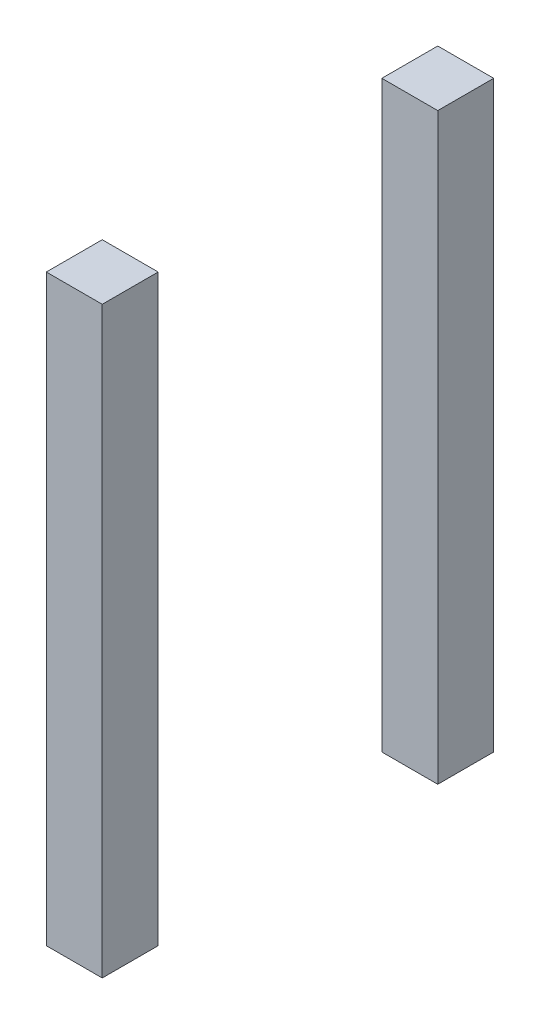
ISO-10303-21;
HEADER;
FILE_DESCRIPTION(('STEP AP214'),'2;1');
FILE_NAME('part.step','',(''),(''),'','','');
FILE_SCHEMA(('AUTOMOTIVE_DESIGN { 1 0 10303 214 1 1 1 1 }'));
ENDSEC;
DATA;
#1=APPLICATION_CONTEXT('core data for automotive mechanical design processes');
#2=APPLICATION_PROTOCOL_DEFINITION('international standard','automotive_design',2000,#1);
#3=PRODUCT_CONTEXT('',#1,'mechanical');
#4=PRODUCT('Part','Part','',(#3));
#5=PRODUCT_RELATED_PRODUCT_CATEGORY('part','',(#4));
#6=PRODUCT_DEFINITION_FORMATION('','',#4);
#7=PRODUCT_DEFINITION_CONTEXT('part definition',#1,'design');
#8=PRODUCT_DEFINITION('design','',#6,#7);
#9=PRODUCT_DEFINITION_SHAPE('','',#8);
#10=(LENGTH_UNIT() NAMED_UNIT(*) SI_UNIT(.MILLI.,.METRE.));
#11=(NAMED_UNIT(*) PLANE_ANGLE_UNIT() SI_UNIT($,.RADIAN.));
#12=(NAMED_UNIT(*) SI_UNIT($,.STERADIAN.) SOLID_ANGLE_UNIT());
#13=UNCERTAINTY_MEASURE_WITH_UNIT(LENGTH_MEASURE(1.E-05),#10,'distance_accuracy_value','');
#14=(GEOMETRIC_REPRESENTATION_CONTEXT(3) GLOBAL_UNCERTAINTY_ASSIGNED_CONTEXT((#13)) GLOBAL_UNIT_ASSIGNED_CONTEXT((#10,
#11,#12)) REPRESENTATION_CONTEXT('',''));
#15=CARTESIAN_POINT('',(0.,0.,0.));
#16=DIRECTION('',(0.,0.,1.));
#17=DIRECTION('',(1.,0.,0.));
#18=AXIS2_PLACEMENT_3D('',#15,#16,#17);
#19=CARTESIAN_POINT('',(0.,-45.0088951198897,0.));
#20=DIRECTION('',(0.,1.,0.));
#21=DIRECTION('',(0.,0.,1.));
#22=AXIS2_PLACEMENT_3D('',#19,#20,#21);
#23=PLANE('',#22);
#24=DIRECTION('',(0.,0.,1.));
#25=VECTOR('',#24,1.);
#26=CARTESIAN_POINT('',(-76.5788995902752,-45.0088951198897,50.3534205439696));
#27=LINE('',#26,#25);
#28=CARTESIAN_POINT('',(-76.5788995902752,-45.0088951198897,41.0824205439696));
#29=VERTEX_POINT('',#28);
#30=CARTESIAN_POINT('',(-76.5788995902752,-45.0088951198897,50.3534205439696));
#31=VERTEX_POINT('',#30);
#32=EDGE_CURVE('E93',#29,#31,#27,.T.);
#33=ORIENTED_EDGE('',*,*,#32,.F.);
#34=DIRECTION('',(-1.,0.,0.));
#35=VECTOR('',#34,1.);
#36=CARTESIAN_POINT('',(-67.3078995902752,-45.0088951198897,41.0824205439696));
#37=LINE('',#36,#35);
#38=CARTESIAN_POINT('',(-67.3078995902752,-45.0088951198897,41.0824205439696));
#39=VERTEX_POINT('',#38);
#40=EDGE_CURVE('E104',#39,#29,#37,.T.);
#41=ORIENTED_EDGE('',*,*,#40,.F.);
#42=DIRECTION('',(0.,0.,-1.));
#43=VECTOR('',#42,1.);
#44=CARTESIAN_POINT('',(-67.3078995902752,-45.0088951198897,50.3534205439696));
#45=LINE('',#44,#43);
#46=CARTESIAN_POINT('',(-67.3078995902752,-45.0088951198897,50.3534205439696));
#47=VERTEX_POINT('',#46);
#48=EDGE_CURVE('E95',#47,#39,#45,.T.);
#49=ORIENTED_EDGE('',*,*,#48,.F.);
#50=DIRECTION('',(1.,0.,0.));
#51=VECTOR('',#50,1.);
#52=CARTESIAN_POINT('',(-67.3078995902752,-45.0088951198897,50.3534205439696));
#53=LINE('',#52,#51);
#54=EDGE_CURVE('E85',#31,#47,#53,.T.);
#55=ORIENTED_EDGE('',*,*,#54,.F.);
#56=EDGE_LOOP('',(#33,#41,#49,#55));
#57=FACE_BOUND('',#56,.T.);
#58=ADVANCED_FACE('F43',(#57),#23,.F.);
#59=CARTESIAN_POINT('',(-67.3078995902752,64.833945483538,41.0824205439696));
#60=DIRECTION('',(0.,0.,1.));
#61=DIRECTION('',(1.,0.,0.));
#62=AXIS2_PLACEMENT_3D('',#59,#60,#61);
#63=PLANE('',#62);
#64=DIRECTION('',(0.,-1.,0.));
#65=VECTOR('',#64,1.);
#66=CARTESIAN_POINT('',(-76.5788995902752,64.833945483538,41.0824205439696));
#67=LINE('',#66,#65);
#68=CARTESIAN_POINT('',(-76.5788995902752,51.722771546777,41.0824205439696));
#69=VERTEX_POINT('',#68);
#70=EDGE_CURVE('E98',#69,#29,#67,.T.);
#71=ORIENTED_EDGE('',*,*,#70,.F.);
#72=DIRECTION('',(1.,0.,0.));
#73=VECTOR('',#72,1.);
#74=CARTESIAN_POINT('',(-67.3078995902752,51.722771546777,41.0824205439696));
#75=LINE('',#74,#73);
#76=CARTESIAN_POINT('',(-67.3078995902752,51.722771546777,41.0824205439696));
#77=VERTEX_POINT('',#76);
#78=EDGE_CURVE('E47',#69,#77,#75,.T.);
#79=ORIENTED_EDGE('',*,*,#78,.T.);
#80=DIRECTION('',(0.,-1.,0.));
#81=VECTOR('',#80,1.);
#82=CARTESIAN_POINT('',(-67.3078995902752,64.833945483538,41.0824205439696));
#83=LINE('',#82,#81);
#84=EDGE_CURVE('E107',#77,#39,#83,.T.);
#85=ORIENTED_EDGE('',*,*,#84,.T.);
#86=ORIENTED_EDGE('',*,*,#40,.T.);
#87=EDGE_LOOP('',(#71,#79,#85,#86));
#88=FACE_BOUND('',#87,.T.);
#89=ADVANCED_FACE('F116',(#88),#63,.F.);
#90=CARTESIAN_POINT('',(-67.3078995902752,64.833945483538,50.3534205439696));
#91=DIRECTION('',(-1.,0.,0.));
#92=DIRECTION('',(0.,0.,1.));
#93=AXIS2_PLACEMENT_3D('',#90,#91,#92);
#94=PLANE('',#93);
#95=ORIENTED_EDGE('',*,*,#84,.F.);
#96=DIRECTION('',(0.,0.,1.));
#97=VECTOR('',#96,1.);
#98=CARTESIAN_POINT('',(-67.3078995902752,51.722771546777,50.3534205439696));
#99=LINE('',#98,#97);
#100=CARTESIAN_POINT('',(-67.3078995902752,51.722771546777,50.3534205439696));
#101=VERTEX_POINT('',#100);
#102=EDGE_CURVE('E113',#77,#101,#99,.T.);
#103=ORIENTED_EDGE('',*,*,#102,.T.);
#104=DIRECTION('',(0.,-1.,0.));
#105=VECTOR('',#104,1.);
#106=CARTESIAN_POINT('',(-67.3078995902752,64.833945483538,50.3534205439696));
#107=LINE('',#106,#105);
#108=EDGE_CURVE('E89',#101,#47,#107,.T.);
#109=ORIENTED_EDGE('',*,*,#108,.T.);
#110=ORIENTED_EDGE('',*,*,#48,.T.);
#111=EDGE_LOOP('',(#95,#103,#109,#110));
#112=FACE_BOUND('',#111,.T.);
#113=ADVANCED_FACE('F112',(#112),#94,.F.);
#114=CARTESIAN_POINT('',(-67.3078995902752,64.833945483538,50.3534205439696));
#115=DIRECTION('',(0.,0.,-1.));
#116=DIRECTION('',(-1.,0.,0.));
#117=AXIS2_PLACEMENT_3D('',#114,#115,#116);
#118=PLANE('',#117);
#119=ORIENTED_EDGE('',*,*,#108,.F.);
#120=DIRECTION('',(-1.,0.,0.));
#121=VECTOR('',#120,1.);
#122=CARTESIAN_POINT('',(-67.3078995902752,51.722771546777,50.3534205439696));
#123=LINE('',#122,#121);
#124=CARTESIAN_POINT('',(-76.5788995902752,51.722771546777,50.3534205439696));
#125=VERTEX_POINT('',#124);
#126=EDGE_CURVE('E52',#101,#125,#123,.T.);
#127=ORIENTED_EDGE('',*,*,#126,.T.);
#128=DIRECTION('',(0.,-1.,0.));
#129=VECTOR('',#128,1.);
#130=CARTESIAN_POINT('',(-76.5788995902752,64.833945483538,50.3534205439696));
#131=LINE('',#130,#129);
#132=EDGE_CURVE('E82',#125,#31,#131,.T.);
#133=ORIENTED_EDGE('',*,*,#132,.T.);
#134=ORIENTED_EDGE('',*,*,#54,.T.);
#135=EDGE_LOOP('',(#119,#127,#133,#134));
#136=FACE_BOUND('',#135,.T.);
#137=ADVANCED_FACE('F84',(#136),#118,.F.);
#138=CARTESIAN_POINT('',(-76.5788995902752,64.833945483538,50.3534205439696));
#139=DIRECTION('',(1.,0.,0.));
#140=DIRECTION('',(0.,0.,-1.));
#141=AXIS2_PLACEMENT_3D('',#138,#139,#140);
#142=PLANE('',#141);
#143=ORIENTED_EDGE('',*,*,#132,.F.);
#144=DIRECTION('',(0.,0.,-1.));
#145=VECTOR('',#144,1.);
#146=CARTESIAN_POINT('',(-76.5788995902752,51.722771546777,50.3534205439696));
#147=LINE('',#146,#145);
#148=EDGE_CURVE('E12',#125,#69,#147,.T.);
#149=ORIENTED_EDGE('',*,*,#148,.T.);
#150=ORIENTED_EDGE('',*,*,#70,.T.);
#151=ORIENTED_EDGE('',*,*,#32,.T.);
#152=EDGE_LOOP('',(#143,#149,#150,#151));
#153=FACE_BOUND('',#152,.T.);
#154=ADVANCED_FACE('F45',(#153),#142,.F.);
#155=CARTESIAN_POINT('',(-80.6591041345707,51.722771546777,62.3549205439696));
#156=DIRECTION('',(0.,-1.,0.));
#157=DIRECTION('',(0.,0.,-1.));
#158=AXIS2_PLACEMENT_3D('',#155,#156,#157);
#159=PLANE('',#158);
#160=ORIENTED_EDGE('',*,*,#126,.F.);
#161=ORIENTED_EDGE('',*,*,#102,.F.);
#162=ORIENTED_EDGE('',*,*,#78,.F.);
#163=ORIENTED_EDGE('',*,*,#148,.F.);
#164=EDGE_LOOP('',(#160,#161,#162,#163));
#165=FACE_BOUND('',#164,.T.);
#166=ADVANCED_FACE('F130',(#165),#159,.F.);
#167=CLOSED_SHELL('',(#58,#89,#113,#137,#154,#166));
#168=MANIFOLD_SOLID_BREP('B2',#167);
#169=CARTESIAN_POINT('',(0.,-45.0088951198897,0.));
#170=DIRECTION('',(0.,-1.,0.));
#171=DIRECTION('',(0.,0.,-1.));
#172=AXIS2_PLACEMENT_3D('',#169,#170,#171);
#173=PLANE('',#172);
#174=DIRECTION('',(0.,0.,-1.));
#175=VECTOR('',#174,1.);
#176=CARTESIAN_POINT('',(-67.3078995902752,-45.0088951198897,-14.5435794560304));
#177=LINE('',#176,#175);
#178=CARTESIAN_POINT('',(-67.3078995902752,-45.0088951198897,-5.27257945603037));
#179=VERTEX_POINT('',#178);
#180=CARTESIAN_POINT('',(-67.3078995902752,-45.0088951198897,-14.5435794560304));
#181=VERTEX_POINT('',#180);
#182=EDGE_CURVE('E217',#179,#181,#177,.T.);
#183=ORIENTED_EDGE('',*,*,#182,.F.);
#184=DIRECTION('',(1.,0.,0.));
#185=VECTOR('',#184,1.);
#186=CARTESIAN_POINT('',(-67.3078995902752,-45.0088951198897,-5.27257945603037));
#187=LINE('',#186,#185);
#188=CARTESIAN_POINT('',(-76.5788995902752,-45.0088951198897,-5.27257945603036));
#189=VERTEX_POINT('',#188);
#190=EDGE_CURVE('E228',#189,#179,#187,.T.);
#191=ORIENTED_EDGE('',*,*,#190,.F.);
#192=DIRECTION('',(0.,0.,1.));
#193=VECTOR('',#192,1.);
#194=CARTESIAN_POINT('',(-76.5788995902752,-45.0088951198897,-14.5435794560304));
#195=LINE('',#194,#193);
#196=CARTESIAN_POINT('',(-76.5788995902752,-45.0088951198897,-14.5435794560304));
#197=VERTEX_POINT('',#196);
#198=EDGE_CURVE('E219',#197,#189,#195,.T.);
#199=ORIENTED_EDGE('',*,*,#198,.F.);
#200=DIRECTION('',(-1.,0.,0.));
#201=VECTOR('',#200,1.);
#202=CARTESIAN_POINT('',(-67.3078995902752,-45.0088951198897,-14.5435794560304));
#203=LINE('',#202,#201);
#204=EDGE_CURVE('E209',#181,#197,#203,.T.);
#205=ORIENTED_EDGE('',*,*,#204,.F.);
#206=EDGE_LOOP('',(#183,#191,#199,#205));
#207=FACE_BOUND('',#206,.T.);
#208=ADVANCED_FACE('F167',(#207),#173,.T.);
#209=CARTESIAN_POINT('',(-67.3078995902752,64.833945483538,-5.27257945603037));
#210=DIRECTION('',(0.,0.,-1.));
#211=DIRECTION('',(-1.,0.,0.));
#212=AXIS2_PLACEMENT_3D('',#209,#210,#211);
#213=PLANE('',#212);
#214=DIRECTION('',(0.,-1.,0.));
#215=VECTOR('',#214,1.);
#216=CARTESIAN_POINT('',(-67.3078995902752,64.833945483538,-5.27257945603037));
#217=LINE('',#216,#215);
#218=CARTESIAN_POINT('',(-67.3078995902752,51.722771546777,-5.27257945603037));
#219=VERTEX_POINT('',#218);
#220=EDGE_CURVE('E222',#219,#179,#217,.T.);
#221=ORIENTED_EDGE('',*,*,#220,.F.);
#222=DIRECTION('',(-1.,0.,0.));
#223=VECTOR('',#222,1.);
#224=CARTESIAN_POINT('',(-67.3078995902752,51.722771546777,-5.27257945603037));
#225=LINE('',#224,#223);
#226=CARTESIAN_POINT('',(-76.5788995902752,51.722771546777,-5.27257945603036));
#227=VERTEX_POINT('',#226);
#228=EDGE_CURVE('E171',#219,#227,#225,.T.);
#229=ORIENTED_EDGE('',*,*,#228,.T.);
#230=DIRECTION('',(0.,-1.,0.));
#231=VECTOR('',#230,1.);
#232=CARTESIAN_POINT('',(-76.5788995902752,64.833945483538,-5.27257945603036));
#233=LINE('',#232,#231);
#234=EDGE_CURVE('E231',#227,#189,#233,.T.);
#235=ORIENTED_EDGE('',*,*,#234,.T.);
#236=ORIENTED_EDGE('',*,*,#190,.T.);
#237=EDGE_LOOP('',(#221,#229,#235,#236));
#238=FACE_BOUND('',#237,.T.);
#239=ADVANCED_FACE('F240',(#238),#213,.F.);
#240=CARTESIAN_POINT('',(-76.5788995902752,64.833945483538,-14.5435794560304));
#241=DIRECTION('',(1.,0.,0.));
#242=DIRECTION('',(0.,0.,-1.));
#243=AXIS2_PLACEMENT_3D('',#240,#241,#242);
#244=PLANE('',#243);
#245=ORIENTED_EDGE('',*,*,#234,.F.);
#246=DIRECTION('',(0.,0.,-1.));
#247=VECTOR('',#246,1.);
#248=CARTESIAN_POINT('',(-76.5788995902752,51.722771546777,-14.5435794560304));
#249=LINE('',#248,#247);
#250=CARTESIAN_POINT('',(-76.5788995902752,51.722771546777,-14.5435794560304));
#251=VERTEX_POINT('',#250);
#252=EDGE_CURVE('E237',#227,#251,#249,.T.);
#253=ORIENTED_EDGE('',*,*,#252,.T.);
#254=DIRECTION('',(0.,-1.,0.));
#255=VECTOR('',#254,1.);
#256=CARTESIAN_POINT('',(-76.5788995902752,64.833945483538,-14.5435794560304));
#257=LINE('',#256,#255);
#258=EDGE_CURVE('E213',#251,#197,#257,.T.);
#259=ORIENTED_EDGE('',*,*,#258,.T.);
#260=ORIENTED_EDGE('',*,*,#198,.T.);
#261=EDGE_LOOP('',(#245,#253,#259,#260));
#262=FACE_BOUND('',#261,.T.);
#263=ADVANCED_FACE('F236',(#262),#244,.F.);
#264=CARTESIAN_POINT('',(-67.3078995902752,64.833945483538,-14.5435794560304));
#265=DIRECTION('',(0.,0.,1.));
#266=DIRECTION('',(1.,0.,0.));
#267=AXIS2_PLACEMENT_3D('',#264,#265,#266);
#268=PLANE('',#267);
#269=ORIENTED_EDGE('',*,*,#258,.F.);
#270=DIRECTION('',(1.,0.,0.));
#271=VECTOR('',#270,1.);
#272=CARTESIAN_POINT('',(-67.3078995902752,51.722771546777,-14.5435794560304));
#273=LINE('',#272,#271);
#274=CARTESIAN_POINT('',(-67.3078995902752,51.722771546777,-14.5435794560304));
#275=VERTEX_POINT('',#274);
#276=EDGE_CURVE('E176',#251,#275,#273,.T.);
#277=ORIENTED_EDGE('',*,*,#276,.T.);
#278=DIRECTION('',(0.,-1.,0.));
#279=VECTOR('',#278,1.);
#280=CARTESIAN_POINT('',(-67.3078995902752,64.833945483538,-14.5435794560304));
#281=LINE('',#280,#279);
#282=EDGE_CURVE('E206',#275,#181,#281,.T.);
#283=ORIENTED_EDGE('',*,*,#282,.T.);
#284=ORIENTED_EDGE('',*,*,#204,.T.);
#285=EDGE_LOOP('',(#269,#277,#283,#284));
#286=FACE_BOUND('',#285,.T.);
#287=ADVANCED_FACE('F208',(#286),#268,.F.);
#288=CARTESIAN_POINT('',(-67.3078995902752,64.833945483538,-14.5435794560304));
#289=DIRECTION('',(-1.,0.,0.));
#290=DIRECTION('',(0.,0.,1.));
#291=AXIS2_PLACEMENT_3D('',#288,#289,#290);
#292=PLANE('',#291);
#293=ORIENTED_EDGE('',*,*,#282,.F.);
#294=DIRECTION('',(0.,0.,1.));
#295=VECTOR('',#294,1.);
#296=CARTESIAN_POINT('',(-67.3078995902752,51.722771546777,-14.5435794560304));
#297=LINE('',#296,#295);
#298=EDGE_CURVE('E41',#275,#219,#297,.T.);
#299=ORIENTED_EDGE('',*,*,#298,.T.);
#300=ORIENTED_EDGE('',*,*,#220,.T.);
#301=ORIENTED_EDGE('',*,*,#182,.T.);
#302=EDGE_LOOP('',(#293,#299,#300,#301));
#303=FACE_BOUND('',#302,.T.);
#304=ADVANCED_FACE('F169',(#303),#292,.F.);
#305=CARTESIAN_POINT('',(-80.6591041345707,51.722771546777,62.3549205439696));
#306=DIRECTION('',(0.,-1.,0.));
#307=DIRECTION('',(0.,0.,-1.));
#308=AXIS2_PLACEMENT_3D('',#305,#306,#307);
#309=PLANE('',#308);
#310=ORIENTED_EDGE('',*,*,#276,.F.);
#311=ORIENTED_EDGE('',*,*,#252,.F.);
#312=ORIENTED_EDGE('',*,*,#228,.F.);
#313=ORIENTED_EDGE('',*,*,#298,.F.);
#314=EDGE_LOOP('',(#310,#311,#312,#313));
#315=FACE_BOUND('',#314,.T.);
#316=ADVANCED_FACE('F254',(#315),#309,.F.);
#317=CLOSED_SHELL('',(#208,#239,#263,#287,#304,#316));
#318=MANIFOLD_SOLID_BREP('B6',#317);
#319=ADVANCED_BREP_SHAPE_REPRESENTATION('',(#18,#168,#318),#14);
#320=SHAPE_DEFINITION_REPRESENTATION(#9,#319);
ENDSEC;
END-ISO-10303-21;
